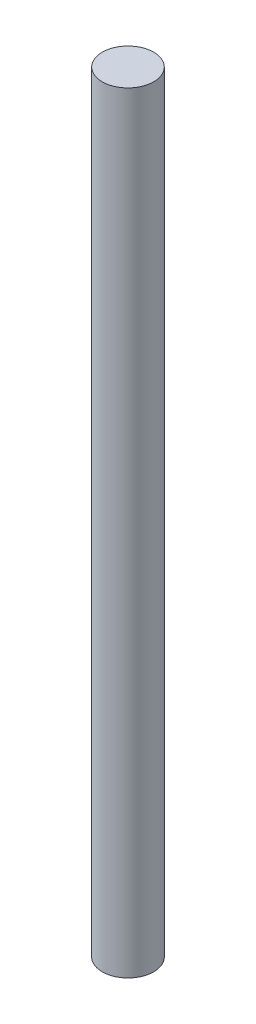
ISO-10303-21;
HEADER;
FILE_DESCRIPTION(('STEP AP214'),'2;1');
FILE_NAME('part.step','',(''),(''),'','','');
FILE_SCHEMA(('AUTOMOTIVE_DESIGN { 1 0 10303 214 1 1 1 1 }'));
ENDSEC;
DATA;
#1=APPLICATION_CONTEXT('core data for automotive mechanical design processes');
#2=APPLICATION_PROTOCOL_DEFINITION('international standard','automotive_design',2000,#1);
#3=PRODUCT_CONTEXT('',#1,'mechanical');
#4=PRODUCT('Part','Part','',(#3));
#5=PRODUCT_RELATED_PRODUCT_CATEGORY('part','',(#4));
#6=PRODUCT_DEFINITION_FORMATION('','',#4);
#7=PRODUCT_DEFINITION_CONTEXT('part definition',#1,'design');
#8=PRODUCT_DEFINITION('design','',#6,#7);
#9=PRODUCT_DEFINITION_SHAPE('','',#8);
#10=(LENGTH_UNIT() NAMED_UNIT(*) SI_UNIT(.MILLI.,.METRE.));
#11=(NAMED_UNIT(*) PLANE_ANGLE_UNIT() SI_UNIT($,.RADIAN.));
#12=(NAMED_UNIT(*) SI_UNIT($,.STERADIAN.) SOLID_ANGLE_UNIT());
#13=UNCERTAINTY_MEASURE_WITH_UNIT(LENGTH_MEASURE(1.E-05),#10,'distance_accuracy_value','');
#14=(GEOMETRIC_REPRESENTATION_CONTEXT(3) GLOBAL_UNCERTAINTY_ASSIGNED_CONTEXT((#13)) GLOBAL_UNIT_ASSIGNED_CONTEXT((#10,
#11,#12)) REPRESENTATION_CONTEXT('',''));
#15=CARTESIAN_POINT('',(0.,0.,0.));
#16=DIRECTION('',(0.,0.,1.));
#17=DIRECTION('',(1.,0.,0.));
#18=AXIS2_PLACEMENT_3D('',#15,#16,#17);
#19=CARTESIAN_POINT('',(0.,120.,0.));
#20=DIRECTION('',(0.,-1.,0.));
#21=DIRECTION('',(0.,0.,-1.));
#22=AXIS2_PLACEMENT_3D('',#19,#20,#21);
#23=CYLINDRICAL_SURFACE('',#22,4.);
#24=CARTESIAN_POINT('',(0.,120.,0.));
#25=DIRECTION('',(0.,1.,0.));
#26=DIRECTION('',(0.,0.,1.));
#27=AXIS2_PLACEMENT_3D('',#24,#25,#26);
#28=CIRCLE('',#27,4.);
#29=CARTESIAN_POINT('',(0.,120.,4.));
#30=VERTEX_POINT('',#29);
#31=EDGE_CURVE('E10',#30,#30,#28,.T.);
#32=ORIENTED_EDGE('',*,*,#31,.F.);
#33=EDGE_LOOP('',(#32));
#34=FACE_BOUND('',#33,.T.);
#35=CARTESIAN_POINT('',(0.,0.,0.));
#36=DIRECTION('',(0.,1.,0.));
#37=DIRECTION('',(0.,0.,1.));
#38=AXIS2_PLACEMENT_3D('',#35,#36,#37);
#39=CIRCLE('',#38,4.);
#40=CARTESIAN_POINT('',(0.,0.,4.));
#41=VERTEX_POINT('',#40);
#42=EDGE_CURVE('E40',#41,#41,#39,.T.);
#43=ORIENTED_EDGE('',*,*,#42,.T.);
#44=EDGE_LOOP('',(#43));
#45=FACE_BOUND('',#44,.T.);
#46=ADVANCED_FACE('F37',(#34,#45),#23,.T.);
#47=CARTESIAN_POINT('',(0.,120.,0.));
#48=DIRECTION('',(0.,1.,0.));
#49=DIRECTION('',(0.,0.,1.));
#50=AXIS2_PLACEMENT_3D('',#47,#48,#49);
#51=PLANE('',#50);
#52=ORIENTED_EDGE('',*,*,#31,.T.);
#53=EDGE_LOOP('',(#52));
#54=FACE_BOUND('',#53,.T.);
#55=ADVANCED_FACE('F54',(#54),#51,.T.);
#56=CARTESIAN_POINT('',(0.,0.,0.));
#57=DIRECTION('',(0.,1.,0.));
#58=DIRECTION('',(0.,0.,1.));
#59=AXIS2_PLACEMENT_3D('',#56,#57,#58);
#60=PLANE('',#59);
#61=ORIENTED_EDGE('',*,*,#42,.F.);
#62=EDGE_LOOP('',(#61));
#63=FACE_BOUND('',#62,.T.);
#64=ADVANCED_FACE('F52',(#63),#60,.F.);
#65=CLOSED_SHELL('',(#46,#55,#64));
#66=MANIFOLD_SOLID_BREP('B2',#65);
#67=ADVANCED_BREP_SHAPE_REPRESENTATION('',(#18,#66),#14);
#68=SHAPE_DEFINITION_REPRESENTATION(#9,#67);
ENDSEC;
END-ISO-10303-21;
